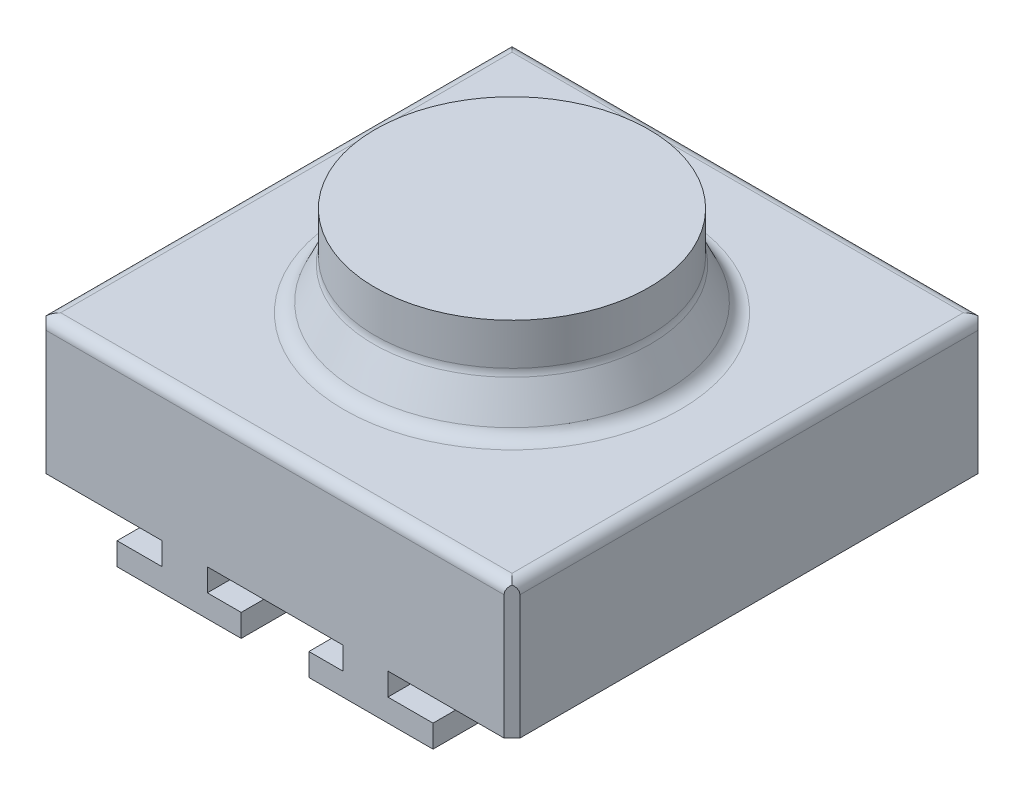
ISO-10303-21;
HEADER;
FILE_DESCRIPTION(('STEP AP214'),'2;1');
FILE_NAME('part.step','',(''),(''),'','','');
FILE_SCHEMA(('AUTOMOTIVE_DESIGN { 1 0 10303 214 1 1 1 1 }'));
ENDSEC;
DATA;
#1=APPLICATION_CONTEXT('core data for automotive mechanical design processes');
#2=APPLICATION_PROTOCOL_DEFINITION('international standard','automotive_design',2000,#1);
#3=PRODUCT_CONTEXT('',#1,'mechanical');
#4=PRODUCT('Part','Part','',(#3));
#5=PRODUCT_RELATED_PRODUCT_CATEGORY('part','',(#4));
#6=PRODUCT_DEFINITION_FORMATION('','',#4);
#7=PRODUCT_DEFINITION_CONTEXT('part definition',#1,'design');
#8=PRODUCT_DEFINITION('design','',#6,#7);
#9=PRODUCT_DEFINITION_SHAPE('','',#8);
#10=(LENGTH_UNIT() NAMED_UNIT(*) SI_UNIT(.MILLI.,.METRE.));
#11=(NAMED_UNIT(*) PLANE_ANGLE_UNIT() SI_UNIT($,.RADIAN.));
#12=(NAMED_UNIT(*) SI_UNIT($,.STERADIAN.) SOLID_ANGLE_UNIT());
#13=UNCERTAINTY_MEASURE_WITH_UNIT(LENGTH_MEASURE(1.E-05),#10,'distance_accuracy_value','');
#14=(GEOMETRIC_REPRESENTATION_CONTEXT(3) GLOBAL_UNCERTAINTY_ASSIGNED_CONTEXT((#13)) GLOBAL_UNIT_ASSIGNED_CONTEXT((#10,
#11,#12)) REPRESENTATION_CONTEXT('',''));
#15=CARTESIAN_POINT('',(0.,0.,0.));
#16=DIRECTION('',(0.,0.,1.));
#17=DIRECTION('',(1.,0.,0.));
#18=AXIS2_PLACEMENT_3D('',#15,#16,#17);
#19=CARTESIAN_POINT('',(0.,10.,210.));
#20=DIRECTION('',(1.,0.,0.));
#21=DIRECTION('',(0.,1.,0.));
#22=AXIS2_PLACEMENT_3D('',#19,#20,#21);
#23=PLANE('',#22);
#24=DIRECTION('',(0.,-1.,0.));
#25=VECTOR('',#24,1.);
#26=CARTESIAN_POINT('',(0.,10.,0.));
#27=LINE('',#26,#25);
#28=CARTESIAN_POINT('',(0.,10.,0.));
#29=VERTEX_POINT('',#28);
#30=CARTESIAN_POINT('',(0.,0.,0.));
#31=VERTEX_POINT('',#30);
#32=EDGE_CURVE('E256',#29,#31,#27,.T.);
#33=ORIENTED_EDGE('',*,*,#32,.T.);
#34=DIRECTION('',(0.,0.,-1.));
#35=VECTOR('',#34,1.);
#36=CARTESIAN_POINT('',(0.,0.,210.));
#37=LINE('',#36,#35);
#38=CARTESIAN_POINT('',(0.,0.,210.));
#39=VERTEX_POINT('',#38);
#40=EDGE_CURVE('E235',#39,#31,#37,.T.);
#41=ORIENTED_EDGE('',*,*,#40,.F.);
#42=DIRECTION('',(0.,-1.,0.));
#43=VECTOR('',#42,1.);
#44=CARTESIAN_POINT('',(0.,10.,210.));
#45=LINE('',#44,#43);
#46=CARTESIAN_POINT('',(0.,10.,210.));
#47=VERTEX_POINT('',#46);
#48=EDGE_CURVE('E243',#47,#39,#45,.T.);
#49=ORIENTED_EDGE('',*,*,#48,.F.);
#50=DIRECTION('',(0.,0.,-1.));
#51=VECTOR('',#50,1.);
#52=CARTESIAN_POINT('',(0.,10.,210.));
#53=LINE('',#52,#51);
#54=EDGE_CURVE('E402',#47,#29,#53,.T.);
#55=ORIENTED_EDGE('',*,*,#54,.T.);
#56=EDGE_LOOP('',(#33,#41,#49,#55));
#57=FACE_BOUND('',#56,.T.);
#58=ADVANCED_FACE('F45',(#57),#23,.F.);
#59=CARTESIAN_POINT('',(0.,0.,210.));
#60=DIRECTION('',(0.,1.,0.));
#61=DIRECTION('',(-1.,0.,0.));
#62=AXIS2_PLACEMENT_3D('',#59,#60,#61);
#63=PLANE('',#62);
#64=DIRECTION('',(1.,0.,0.));
#65=VECTOR('',#64,1.);
#66=CARTESIAN_POINT('',(0.,0.,0.));
#67=LINE('',#66,#65);
#68=CARTESIAN_POINT('',(55.,0.,0.));
#69=VERTEX_POINT('',#68);
#70=EDGE_CURVE('E356',#31,#69,#67,.T.);
#71=ORIENTED_EDGE('',*,*,#70,.T.);
#72=DIRECTION('',(0.,0.,-1.));
#73=VECTOR('',#72,1.);
#74=CARTESIAN_POINT('',(55.,0.,210.));
#75=LINE('',#74,#73);
#76=CARTESIAN_POINT('',(55.,0.,210.));
#77=VERTEX_POINT('',#76);
#78=EDGE_CURVE('E238',#77,#69,#75,.T.);
#79=ORIENTED_EDGE('',*,*,#78,.F.);
#80=DIRECTION('',(1.,0.,0.));
#81=VECTOR('',#80,1.);
#82=CARTESIAN_POINT('',(0.,0.,210.));
#83=LINE('',#82,#81);
#84=EDGE_CURVE('E231',#39,#77,#83,.T.);
#85=ORIENTED_EDGE('',*,*,#84,.F.);
#86=ORIENTED_EDGE('',*,*,#40,.T.);
#87=EDGE_LOOP('',(#71,#79,#85,#86));
#88=FACE_BOUND('',#87,.T.);
#89=ADVANCED_FACE('F233',(#88),#63,.F.);
#90=CARTESIAN_POINT('',(55.,0.,210.));
#91=DIRECTION('',(-1.,0.,0.));
#92=DIRECTION('',(0.,-1.,0.));
#93=AXIS2_PLACEMENT_3D('',#90,#91,#92);
#94=PLANE('',#93);
#95=DIRECTION('',(0.,1.,0.));
#96=VECTOR('',#95,1.);
#97=CARTESIAN_POINT('',(55.,0.,0.));
#98=LINE('',#97,#96);
#99=CARTESIAN_POINT('',(55.,9.99999999999997,0.));
#100=VERTEX_POINT('',#99);
#101=EDGE_CURVE('E406',#69,#100,#98,.T.);
#102=ORIENTED_EDGE('',*,*,#101,.T.);
#103=DIRECTION('',(0.,0.,-1.));
#104=VECTOR('',#103,1.);
#105=CARTESIAN_POINT('',(55.,9.99999999999997,210.));
#106=LINE('',#105,#104);
#107=CARTESIAN_POINT('',(55.,9.99999999999997,210.));
#108=VERTEX_POINT('',#107);
#109=EDGE_CURVE('E266',#108,#100,#106,.T.);
#110=ORIENTED_EDGE('',*,*,#109,.F.);
#111=DIRECTION('',(0.,1.,0.));
#112=VECTOR('',#111,1.);
#113=CARTESIAN_POINT('',(55.,0.,210.));
#114=LINE('',#113,#112);
#115=EDGE_CURVE('E242',#77,#108,#114,.T.);
#116=ORIENTED_EDGE('',*,*,#115,.F.);
#117=ORIENTED_EDGE('',*,*,#78,.T.);
#118=EDGE_LOOP('',(#102,#110,#116,#117));
#119=FACE_BOUND('',#118,.T.);
#120=ADVANCED_FACE('F530',(#119),#94,.F.);
#121=CARTESIAN_POINT('',(55.,9.99999999999997,210.));
#122=DIRECTION('',(0.,-1.,0.));
#123=DIRECTION('',(1.,0.,0.));
#124=AXIS2_PLACEMENT_3D('',#121,#122,#123);
#125=PLANE('',#124);
#126=DIRECTION('',(-1.,0.,0.));
#127=VECTOR('',#126,1.);
#128=CARTESIAN_POINT('',(55.,9.99999999999997,0.));
#129=LINE('',#128,#127);
#130=CARTESIAN_POINT('',(40.,10.,0.));
#131=VERTEX_POINT('',#130);
#132=EDGE_CURVE('E409',#100,#131,#129,.T.);
#133=ORIENTED_EDGE('',*,*,#132,.T.);
#134=DIRECTION('',(0.,0.,-1.));
#135=VECTOR('',#134,1.);
#136=CARTESIAN_POINT('',(40.,10.,210.));
#137=LINE('',#136,#135);
#138=CARTESIAN_POINT('',(40.,10.,210.));
#139=VERTEX_POINT('',#138);
#140=EDGE_CURVE('E502',#139,#131,#137,.T.);
#141=ORIENTED_EDGE('',*,*,#140,.F.);
#142=DIRECTION('',(-1.,0.,0.));
#143=VECTOR('',#142,1.);
#144=CARTESIAN_POINT('',(55.,9.99999999999997,210.));
#145=LINE('',#144,#143);
#146=EDGE_CURVE('E361',#108,#139,#145,.T.);
#147=ORIENTED_EDGE('',*,*,#146,.F.);
#148=ORIENTED_EDGE('',*,*,#109,.T.);
#149=EDGE_LOOP('',(#133,#141,#147,#148));
#150=FACE_BOUND('',#149,.T.);
#151=ADVANCED_FACE('F511',(#150),#125,.F.);
#152=CARTESIAN_POINT('',(40.,10.,210.));
#153=DIRECTION('',(-1.,0.,0.));
#154=DIRECTION('',(0.,0.,1.));
#155=AXIS2_PLACEMENT_3D('',#152,#153,#154);
#156=PLANE('',#155);
#157=DIRECTION('',(0.,1.,0.));
#158=VECTOR('',#157,1.);
#159=CARTESIAN_POINT('',(40.,10.,0.));
#160=LINE('',#159,#158);
#161=CARTESIAN_POINT('',(40.,20.,0.));
#162=VERTEX_POINT('',#161);
#163=EDGE_CURVE('E412',#131,#162,#160,.T.);
#164=ORIENTED_EDGE('',*,*,#163,.T.);
#165=DIRECTION('',(0.,0.,-1.));
#166=VECTOR('',#165,1.);
#167=CARTESIAN_POINT('',(40.,20.,210.));
#168=LINE('',#167,#166);
#169=CARTESIAN_POINT('',(40.,20.,210.));
#170=VERTEX_POINT('',#169);
#171=EDGE_CURVE('E498',#170,#162,#168,.T.);
#172=ORIENTED_EDGE('',*,*,#171,.F.);
#173=DIRECTION('',(0.,1.,0.));
#174=VECTOR('',#173,1.);
#175=CARTESIAN_POINT('',(40.,10.,210.));
#176=LINE('',#175,#174);
#177=EDGE_CURVE('E364',#139,#170,#176,.T.);
#178=ORIENTED_EDGE('',*,*,#177,.F.);
#179=ORIENTED_EDGE('',*,*,#140,.T.);
#180=EDGE_LOOP('',(#164,#172,#178,#179));
#181=FACE_BOUND('',#180,.T.);
#182=ADVANCED_FACE('F522',(#181),#156,.F.);
#183=CARTESIAN_POINT('',(100.,20.,210.));
#184=DIRECTION('',(0.,1.,0.));
#185=DIRECTION('',(-1.,0.,0.));
#186=AXIS2_PLACEMENT_3D('',#183,#184,#185);
#187=PLANE('',#186);
#188=DIRECTION('',(1.,0.,0.));
#189=VECTOR('',#188,1.);
#190=CARTESIAN_POINT('',(100.,20.,0.));
#191=LINE('',#190,#189);
#192=CARTESIAN_POINT('',(100.,20.,0.));
#193=VERTEX_POINT('',#192);
#194=EDGE_CURVE('E414',#162,#193,#191,.T.);
#195=ORIENTED_EDGE('',*,*,#194,.T.);
#196=DIRECTION('',(0.,0.,-1.));
#197=VECTOR('',#196,1.);
#198=CARTESIAN_POINT('',(100.,20.,210.));
#199=LINE('',#198,#197);
#200=CARTESIAN_POINT('',(100.,20.,210.));
#201=VERTEX_POINT('',#200);
#202=EDGE_CURVE('E494',#201,#193,#199,.T.);
#203=ORIENTED_EDGE('',*,*,#202,.F.);
#204=DIRECTION('',(1.,0.,0.));
#205=VECTOR('',#204,1.);
#206=CARTESIAN_POINT('',(100.,20.,210.));
#207=LINE('',#206,#205);
#208=EDGE_CURVE('E367',#170,#201,#207,.T.);
#209=ORIENTED_EDGE('',*,*,#208,.F.);
#210=ORIENTED_EDGE('',*,*,#171,.T.);
#211=EDGE_LOOP('',(#195,#203,#209,#210));
#212=FACE_BOUND('',#211,.T.);
#213=ADVANCED_FACE('F526',(#212),#187,.F.);
#214=CARTESIAN_POINT('',(100.,10.,210.));
#215=DIRECTION('',(1.,0.,0.));
#216=DIRECTION('',(0.,0.,-1.));
#217=AXIS2_PLACEMENT_3D('',#214,#215,#216);
#218=PLANE('',#217);
#219=DIRECTION('',(0.,-1.,0.));
#220=VECTOR('',#219,1.);
#221=CARTESIAN_POINT('',(100.,10.,0.));
#222=LINE('',#221,#220);
#223=CARTESIAN_POINT('',(100.,10.,0.));
#224=VERTEX_POINT('',#223);
#225=EDGE_CURVE('E417',#193,#224,#222,.T.);
#226=ORIENTED_EDGE('',*,*,#225,.T.);
#227=DIRECTION('',(0.,0.,-1.));
#228=VECTOR('',#227,1.);
#229=CARTESIAN_POINT('',(100.,10.,210.));
#230=LINE('',#229,#228);
#231=CARTESIAN_POINT('',(100.,10.,210.));
#232=VERTEX_POINT('',#231);
#233=EDGE_CURVE('E490',#232,#224,#230,.T.);
#234=ORIENTED_EDGE('',*,*,#233,.F.);
#235=DIRECTION('',(0.,-1.,0.));
#236=VECTOR('',#235,1.);
#237=CARTESIAN_POINT('',(100.,10.,210.));
#238=LINE('',#237,#236);
#239=EDGE_CURVE('E370',#201,#232,#238,.T.);
#240=ORIENTED_EDGE('',*,*,#239,.F.);
#241=ORIENTED_EDGE('',*,*,#202,.T.);
#242=EDGE_LOOP('',(#226,#234,#240,#241));
#243=FACE_BOUND('',#242,.T.);
#244=ADVANCED_FACE('F683',(#243),#218,.F.);
#245=CARTESIAN_POINT('',(85.,10.,210.));
#246=DIRECTION('',(0.,-1.,0.));
#247=DIRECTION('',(1.,0.,0.));
#248=AXIS2_PLACEMENT_3D('',#245,#246,#247);
#249=PLANE('',#248);
#250=DIRECTION('',(-1.,0.,0.));
#251=VECTOR('',#250,1.);
#252=CARTESIAN_POINT('',(85.,10.,0.));
#253=LINE('',#252,#251);
#254=CARTESIAN_POINT('',(85.,10.,0.));
#255=VERTEX_POINT('',#254);
#256=EDGE_CURVE('E420',#224,#255,#253,.T.);
#257=ORIENTED_EDGE('',*,*,#256,.T.);
#258=DIRECTION('',(0.,0.,-1.));
#259=VECTOR('',#258,1.);
#260=CARTESIAN_POINT('',(85.,10.,210.));
#261=LINE('',#260,#259);
#262=CARTESIAN_POINT('',(85.,10.,210.));
#263=VERTEX_POINT('',#262);
#264=EDGE_CURVE('E486',#263,#255,#261,.T.);
#265=ORIENTED_EDGE('',*,*,#264,.F.);
#266=DIRECTION('',(-1.,0.,0.));
#267=VECTOR('',#266,1.);
#268=CARTESIAN_POINT('',(85.,10.,210.));
#269=LINE('',#268,#267);
#270=EDGE_CURVE('E373',#232,#263,#269,.T.);
#271=ORIENTED_EDGE('',*,*,#270,.F.);
#272=ORIENTED_EDGE('',*,*,#233,.T.);
#273=EDGE_LOOP('',(#257,#265,#271,#272));
#274=FACE_BOUND('',#273,.T.);
#275=ADVANCED_FACE('F679',(#274),#249,.F.);
#276=CARTESIAN_POINT('',(85.,0.,210.));
#277=DIRECTION('',(1.,0.,0.));
#278=DIRECTION('',(0.,0.,-1.));
#279=AXIS2_PLACEMENT_3D('',#276,#277,#278);
#280=PLANE('',#279);
#281=DIRECTION('',(0.,-1.,0.));
#282=VECTOR('',#281,1.);
#283=CARTESIAN_POINT('',(85.,0.,0.));
#284=LINE('',#283,#282);
#285=CARTESIAN_POINT('',(85.,0.,0.));
#286=VERTEX_POINT('',#285);
#287=EDGE_CURVE('E423',#255,#286,#284,.T.);
#288=ORIENTED_EDGE('',*,*,#287,.T.);
#289=DIRECTION('',(0.,0.,-1.));
#290=VECTOR('',#289,1.);
#291=CARTESIAN_POINT('',(85.,0.,210.));
#292=LINE('',#291,#290);
#293=CARTESIAN_POINT('',(85.,0.,210.));
#294=VERTEX_POINT('',#293);
#295=EDGE_CURVE('E482',#294,#286,#292,.T.);
#296=ORIENTED_EDGE('',*,*,#295,.F.);
#297=DIRECTION('',(0.,-1.,0.));
#298=VECTOR('',#297,1.);
#299=CARTESIAN_POINT('',(85.,0.,210.));
#300=LINE('',#299,#298);
#301=EDGE_CURVE('E376',#263,#294,#300,.T.);
#302=ORIENTED_EDGE('',*,*,#301,.F.);
#303=ORIENTED_EDGE('',*,*,#264,.T.);
#304=EDGE_LOOP('',(#288,#296,#302,#303));
#305=FACE_BOUND('',#304,.T.);
#306=ADVANCED_FACE('F675',(#305),#280,.F.);
#307=CARTESIAN_POINT('',(140.,0.,210.));
#308=DIRECTION('',(0.,1.,0.));
#309=DIRECTION('',(0.,0.,1.));
#310=AXIS2_PLACEMENT_3D('',#307,#308,#309);
#311=PLANE('',#310);
#312=DIRECTION('',(1.,0.,0.));
#313=VECTOR('',#312,1.);
#314=CARTESIAN_POINT('',(140.,0.,0.));
#315=LINE('',#314,#313);
#316=CARTESIAN_POINT('',(140.,0.,0.));
#317=VERTEX_POINT('',#316);
#318=EDGE_CURVE('E426',#286,#317,#315,.T.);
#319=ORIENTED_EDGE('',*,*,#318,.T.);
#320=DIRECTION('',(0.,0.,-1.));
#321=VECTOR('',#320,1.);
#322=CARTESIAN_POINT('',(140.,0.,210.));
#323=LINE('',#322,#321);
#324=CARTESIAN_POINT('',(140.,0.,210.));
#325=VERTEX_POINT('',#324);
#326=EDGE_CURVE('E478',#325,#317,#323,.T.);
#327=ORIENTED_EDGE('',*,*,#326,.F.);
#328=DIRECTION('',(1.,0.,0.));
#329=VECTOR('',#328,1.);
#330=CARTESIAN_POINT('',(140.,0.,210.));
#331=LINE('',#330,#329);
#332=EDGE_CURVE('E379',#294,#325,#331,.T.);
#333=ORIENTED_EDGE('',*,*,#332,.F.);
#334=ORIENTED_EDGE('',*,*,#295,.T.);
#335=EDGE_LOOP('',(#319,#327,#333,#334));
#336=FACE_BOUND('',#335,.T.);
#337=ADVANCED_FACE('F671',(#336),#311,.F.);
#338=CARTESIAN_POINT('',(140.,9.99999999999999,210.));
#339=DIRECTION('',(-1.,0.,0.));
#340=DIRECTION('',(0.,0.,1.));
#341=AXIS2_PLACEMENT_3D('',#338,#339,#340);
#342=PLANE('',#341);
#343=DIRECTION('',(0.,1.,0.));
#344=VECTOR('',#343,1.);
#345=CARTESIAN_POINT('',(140.,9.99999999999999,0.));
#346=LINE('',#345,#344);
#347=CARTESIAN_POINT('',(140.,9.99999999999999,0.));
#348=VERTEX_POINT('',#347);
#349=EDGE_CURVE('E429',#317,#348,#346,.T.);
#350=ORIENTED_EDGE('',*,*,#349,.T.);
#351=DIRECTION('',(0.,0.,-1.));
#352=VECTOR('',#351,1.);
#353=CARTESIAN_POINT('',(140.,9.99999999999999,210.));
#354=LINE('',#353,#352);
#355=CARTESIAN_POINT('',(140.,9.99999999999999,210.));
#356=VERTEX_POINT('',#355);
#357=EDGE_CURVE('E474',#356,#348,#354,.T.);
#358=ORIENTED_EDGE('',*,*,#357,.F.);
#359=DIRECTION('',(0.,1.,0.));
#360=VECTOR('',#359,1.);
#361=CARTESIAN_POINT('',(140.,9.99999999999999,210.));
#362=LINE('',#361,#360);
#363=EDGE_CURVE('E382',#325,#356,#362,.T.);
#364=ORIENTED_EDGE('',*,*,#363,.F.);
#365=ORIENTED_EDGE('',*,*,#326,.T.);
#366=EDGE_LOOP('',(#350,#358,#364,#365));
#367=FACE_BOUND('',#366,.T.);
#368=ADVANCED_FACE('F667',(#367),#342,.F.);
#369=CARTESIAN_POINT('',(120.,10.,210.));
#370=DIRECTION('',(0.,-1.,0.));
#371=DIRECTION('',(1.,0.,0.));
#372=AXIS2_PLACEMENT_3D('',#369,#370,#371);
#373=PLANE('',#372);
#374=DIRECTION('',(-1.,0.,0.));
#375=VECTOR('',#374,1.);
#376=CARTESIAN_POINT('',(120.,10.,0.));
#377=LINE('',#376,#375);
#378=CARTESIAN_POINT('',(120.,10.,0.));
#379=VERTEX_POINT('',#378);
#380=EDGE_CURVE('E431',#348,#379,#377,.T.);
#381=ORIENTED_EDGE('',*,*,#380,.T.);
#382=DIRECTION('',(0.,0.,-1.));
#383=VECTOR('',#382,1.);
#384=CARTESIAN_POINT('',(120.,10.,210.));
#385=LINE('',#384,#383);
#386=CARTESIAN_POINT('',(120.,10.,210.));
#387=VERTEX_POINT('',#386);
#388=EDGE_CURVE('E470',#387,#379,#385,.T.);
#389=ORIENTED_EDGE('',*,*,#388,.F.);
#390=DIRECTION('',(-1.,0.,0.));
#391=VECTOR('',#390,1.);
#392=CARTESIAN_POINT('',(120.,10.,210.));
#393=LINE('',#392,#391);
#394=EDGE_CURVE('E385',#356,#387,#393,.T.);
#395=ORIENTED_EDGE('',*,*,#394,.F.);
#396=ORIENTED_EDGE('',*,*,#357,.T.);
#397=EDGE_LOOP('',(#381,#389,#395,#396));
#398=FACE_BOUND('',#397,.T.);
#399=ADVANCED_FACE('F663',(#398),#373,.F.);
#400=CARTESIAN_POINT('',(120.,20.,210.));
#401=DIRECTION('',(-1.,0.,0.));
#402=DIRECTION('',(0.,0.,1.));
#403=AXIS2_PLACEMENT_3D('',#400,#401,#402);
#404=PLANE('',#403);
#405=DIRECTION('',(0.,1.,0.));
#406=VECTOR('',#405,1.);
#407=CARTESIAN_POINT('',(120.,20.,0.));
#408=LINE('',#407,#406);
#409=CARTESIAN_POINT('',(120.,20.,0.));
#410=VERTEX_POINT('',#409);
#411=EDGE_CURVE('E434',#379,#410,#408,.T.);
#412=ORIENTED_EDGE('',*,*,#411,.T.);
#413=DIRECTION('',(0.,0.,-1.));
#414=VECTOR('',#413,1.);
#415=CARTESIAN_POINT('',(120.,20.,210.));
#416=LINE('',#415,#414);
#417=CARTESIAN_POINT('',(120.,20.,210.));
#418=VERTEX_POINT('',#417);
#419=EDGE_CURVE('E466',#418,#410,#416,.T.);
#420=ORIENTED_EDGE('',*,*,#419,.F.);
#421=DIRECTION('',(0.,1.,0.));
#422=VECTOR('',#421,1.);
#423=CARTESIAN_POINT('',(120.,20.,210.));
#424=LINE('',#423,#422);
#425=EDGE_CURVE('E388',#387,#418,#424,.T.);
#426=ORIENTED_EDGE('',*,*,#425,.F.);
#427=ORIENTED_EDGE('',*,*,#388,.T.);
#428=EDGE_LOOP('',(#412,#420,#426,#427));
#429=FACE_BOUND('',#428,.T.);
#430=ADVANCED_FACE('F660',(#429),#404,.F.);
#431=CARTESIAN_POINT('',(175.,20.,210.));
#432=DIRECTION('',(0.,1.,0.));
#433=DIRECTION('',(-1.,0.,0.));
#434=AXIS2_PLACEMENT_3D('',#431,#432,#433);
#435=PLANE('',#434);
#436=DIRECTION('',(1.,0.,0.));
#437=VECTOR('',#436,1.);
#438=CARTESIAN_POINT('',(175.,20.,0.));
#439=LINE('',#438,#437);
#440=CARTESIAN_POINT('',(171.5,20.,0.));
#441=VERTEX_POINT('',#440);
#442=EDGE_CURVE('E437',#410,#441,#439,.T.);
#443=ORIENTED_EDGE('',*,*,#442,.T.);
#444=DIRECTION('',(-0.707106781186548,0.,-0.707106781186547));
#445=VECTOR('',#444,1.);
#446=CARTESIAN_POINT('',(175.,20.,3.49999999999999));
#447=LINE('',#446,#445);
#448=CARTESIAN_POINT('',(175.,20.,3.5));
#449=VERTEX_POINT('',#448);
#450=EDGE_CURVE('E287',#441,#449,#447,.F.);
#451=ORIENTED_EDGE('',*,*,#450,.T.);
#452=DIRECTION('',(0.,0.,-1.));
#453=VECTOR('',#452,1.);
#454=CARTESIAN_POINT('',(175.,20.,210.));
#455=LINE('',#454,#453);
#456=CARTESIAN_POINT('',(175.,20.,206.5));
#457=VERTEX_POINT('',#456);
#458=EDGE_CURVE('E462',#457,#449,#455,.T.);
#459=ORIENTED_EDGE('',*,*,#458,.F.);
#460=DIRECTION('',(-0.707106781186548,0.,0.707106781186547));
#461=VECTOR('',#460,1.);
#462=CARTESIAN_POINT('',(171.5,20.,210.));
#463=LINE('',#462,#461);
#464=CARTESIAN_POINT('',(171.5,20.,210.));
#465=VERTEX_POINT('',#464);
#466=EDGE_CURVE('E285',#457,#465,#463,.T.);
#467=ORIENTED_EDGE('',*,*,#466,.T.);
#468=DIRECTION('',(1.,0.,0.));
#469=VECTOR('',#468,1.);
#470=CARTESIAN_POINT('',(175.,20.,210.));
#471=LINE('',#470,#469);
#472=EDGE_CURVE('E391',#418,#465,#471,.T.);
#473=ORIENTED_EDGE('',*,*,#472,.F.);
#474=ORIENTED_EDGE('',*,*,#419,.T.);
#475=EDGE_LOOP('',(#443,#451,#459,#467,#473,#474));
#476=FACE_BOUND('',#475,.T.);
#477=ADVANCED_FACE('F616',(#476),#435,.F.);
#478=CARTESIAN_POINT('',(175.,80.,210.));
#479=DIRECTION('',(-1.,0.,0.));
#480=DIRECTION('',(0.,-1.,0.));
#481=AXIS2_PLACEMENT_3D('',#478,#479,#480);
#482=PLANE('',#481);
#483=DIRECTION('',(0.,1.,0.));
#484=VECTOR('',#483,1.);
#485=CARTESIAN_POINT('',(175.,80.,3.5));
#486=LINE('',#485,#484);
#487=CARTESIAN_POINT('',(175.,75.,3.5));
#488=VERTEX_POINT('',#487);
#489=EDGE_CURVE('E282',#449,#488,#486,.T.);
#490=ORIENTED_EDGE('',*,*,#489,.T.);
#491=DIRECTION('',(0.,0.,-1.));
#492=VECTOR('',#491,1.);
#493=CARTESIAN_POINT('',(175.,75.,210.));
#494=LINE('',#493,#492);
#495=CARTESIAN_POINT('',(175.,75.,206.5));
#496=VERTEX_POINT('',#495);
#497=EDGE_CURVE('E331',#488,#496,#494,.F.);
#498=ORIENTED_EDGE('',*,*,#497,.T.);
#499=DIRECTION('',(0.,-1.,0.));
#500=VECTOR('',#499,1.);
#501=CARTESIAN_POINT('',(175.,20.,206.5));
#502=LINE('',#501,#500);
#503=EDGE_CURVE('E280',#496,#457,#502,.T.);
#504=ORIENTED_EDGE('',*,*,#503,.T.);
#505=ORIENTED_EDGE('',*,*,#458,.T.);
#506=EDGE_LOOP('',(#490,#498,#504,#505));
#507=FACE_BOUND('',#506,.T.);
#508=ADVANCED_FACE('F620',(#507),#482,.F.);
#509=CARTESIAN_POINT('',(-35.,80.,210.));
#510=DIRECTION('',(0.,-1.,0.));
#511=DIRECTION('',(1.,0.,0.));
#512=AXIS2_PLACEMENT_3D('',#509,#510,#511);
#513=PLANE('',#512);
#514=DIRECTION('',(-1.,0.,0.));
#515=VECTOR('',#514,1.);
#516=CARTESIAN_POINT('',(-35.,80.,5.));
#517=LINE('',#516,#515);
#518=CARTESIAN_POINT('',(170.,80.,5.));
#519=VERTEX_POINT('',#518);
#520=CARTESIAN_POINT('',(-30.,80.,5.));
#521=VERTEX_POINT('',#520);
#522=EDGE_CURVE('E316',#519,#521,#517,.T.);
#523=ORIENTED_EDGE('',*,*,#522,.T.);
#524=DIRECTION('',(0.,0.,-1.));
#525=VECTOR('',#524,1.);
#526=CARTESIAN_POINT('',(-30.,80.,210.));
#527=LINE('',#526,#525);
#528=CARTESIAN_POINT('',(-30.,80.,205.));
#529=VERTEX_POINT('',#528);
#530=EDGE_CURVE('E318',#521,#529,#527,.F.);
#531=ORIENTED_EDGE('',*,*,#530,.T.);
#532=DIRECTION('',(-1.,0.,0.));
#533=VECTOR('',#532,1.);
#534=CARTESIAN_POINT('',(171.5,80.,205.));
#535=LINE('',#534,#533);
#536=CARTESIAN_POINT('',(170.,80.,205.));
#537=VERTEX_POINT('',#536);
#538=EDGE_CURVE('E312',#529,#537,#535,.F.);
#539=ORIENTED_EDGE('',*,*,#538,.T.);
#540=DIRECTION('',(0.,0.,-1.));
#541=VECTOR('',#540,1.);
#542=CARTESIAN_POINT('',(170.,80.,210.));
#543=LINE('',#542,#541);
#544=EDGE_CURVE('E314',#537,#519,#543,.T.);
#545=ORIENTED_EDGE('',*,*,#544,.T.);
#546=EDGE_LOOP('',(#523,#531,#539,#545));
#547=FACE_BOUND('',#546,.T.);
#548=CARTESIAN_POINT('',(70.,80.,105.));
#549=DIRECTION('',(0.,-1.,0.));
#550=DIRECTION('',(1.,0.,0.));
#551=AXIS2_PLACEMENT_3D('',#548,#549,#550);
#552=CIRCLE('',#551,74.4594918256525);
#553=CARTESIAN_POINT('',(144.459491825652,80.,105.));
#554=VERTEX_POINT('',#553);
#555=EDGE_CURVE('E302',#554,#554,#552,.T.);
#556=ORIENTED_EDGE('',*,*,#555,.T.);
#557=EDGE_LOOP('',(#556));
#558=FACE_BOUND('',#557,.T.);
#559=ADVANCED_FACE('F600',(#547,#558),#513,.F.);
#560=CARTESIAN_POINT('',(-35.,20.,210.));
#561=DIRECTION('',(1.,0.,0.));
#562=DIRECTION('',(0.,0.,-1.));
#563=AXIS2_PLACEMENT_3D('',#560,#561,#562);
#564=PLANE('',#563);
#565=DIRECTION('',(0.,1.,0.));
#566=VECTOR('',#565,1.);
#567=CARTESIAN_POINT('',(-35.,80.,206.5));
#568=LINE('',#567,#566);
#569=CARTESIAN_POINT('',(-35.,20.,206.5));
#570=VERTEX_POINT('',#569);
#571=CARTESIAN_POINT('',(-35.,75.,206.5));
#572=VERTEX_POINT('',#571);
#573=EDGE_CURVE('E258',#570,#572,#568,.T.);
#574=ORIENTED_EDGE('',*,*,#573,.T.);
#575=DIRECTION('',(0.,0.,-1.));
#576=VECTOR('',#575,1.);
#577=CARTESIAN_POINT('',(-35.,75.,210.));
#578=LINE('',#577,#576);
#579=CARTESIAN_POINT('',(-35.,75.,3.5));
#580=VERTEX_POINT('',#579);
#581=EDGE_CURVE('E305',#572,#580,#578,.T.);
#582=ORIENTED_EDGE('',*,*,#581,.T.);
#583=DIRECTION('',(0.,-1.,0.));
#584=VECTOR('',#583,1.);
#585=CARTESIAN_POINT('',(-35.,20.,3.5));
#586=LINE('',#585,#584);
#587=CARTESIAN_POINT('',(-35.,20.,3.5));
#588=VERTEX_POINT('',#587);
#589=EDGE_CURVE('E263',#580,#588,#586,.T.);
#590=ORIENTED_EDGE('',*,*,#589,.T.);
#591=DIRECTION('',(0.,0.,-1.));
#592=VECTOR('',#591,1.);
#593=CARTESIAN_POINT('',(-35.,20.,210.));
#594=LINE('',#593,#592);
#595=EDGE_CURVE('E458',#570,#588,#594,.T.);
#596=ORIENTED_EDGE('',*,*,#595,.F.);
#597=EDGE_LOOP('',(#574,#582,#590,#596));
#598=FACE_BOUND('',#597,.T.);
#599=ADVANCED_FACE('F629',(#598),#564,.F.);
#600=CARTESIAN_POINT('',(20.,20.,210.));
#601=DIRECTION('',(0.,1.,0.));
#602=DIRECTION('',(-1.,0.,0.));
#603=AXIS2_PLACEMENT_3D('',#600,#601,#602);
#604=PLANE('',#603);
#605=ORIENTED_EDGE('',*,*,#595,.T.);
#606=DIRECTION('',(-0.707106781186548,0.,0.707106781186548));
#607=VECTOR('',#606,1.);
#608=CARTESIAN_POINT('',(-35.,20.,3.5));
#609=LINE('',#608,#607);
#610=CARTESIAN_POINT('',(-31.5,20.,0.));
#611=VERTEX_POINT('',#610);
#612=EDGE_CURVE('E273',#588,#611,#609,.F.);
#613=ORIENTED_EDGE('',*,*,#612,.T.);
#614=DIRECTION('',(1.,0.,0.));
#615=VECTOR('',#614,1.);
#616=CARTESIAN_POINT('',(20.,20.,0.));
#617=LINE('',#616,#615);
#618=CARTESIAN_POINT('',(20.,20.,0.));
#619=VERTEX_POINT('',#618);
#620=EDGE_CURVE('E441',#611,#619,#617,.T.);
#621=ORIENTED_EDGE('',*,*,#620,.T.);
#622=DIRECTION('',(0.,0.,-1.));
#623=VECTOR('',#622,1.);
#624=CARTESIAN_POINT('',(20.,20.,210.));
#625=LINE('',#624,#623);
#626=CARTESIAN_POINT('',(20.,20.,210.));
#627=VERTEX_POINT('',#626);
#628=EDGE_CURVE('E454',#627,#619,#625,.T.);
#629=ORIENTED_EDGE('',*,*,#628,.F.);
#630=DIRECTION('',(1.,0.,0.));
#631=VECTOR('',#630,1.);
#632=CARTESIAN_POINT('',(20.,20.,210.));
#633=LINE('',#632,#631);
#634=CARTESIAN_POINT('',(-31.4999999999999,20.,210.));
#635=VERTEX_POINT('',#634);
#636=EDGE_CURVE('E395',#635,#627,#633,.T.);
#637=ORIENTED_EDGE('',*,*,#636,.F.);
#638=DIRECTION('',(-0.707106781186548,0.,-0.707106781186548));
#639=VECTOR('',#638,1.);
#640=CARTESIAN_POINT('',(-31.4999999999999,20.,210.));
#641=LINE('',#640,#639);
#642=EDGE_CURVE('E271',#635,#570,#641,.T.);
#643=ORIENTED_EDGE('',*,*,#642,.T.);
#644=EDGE_LOOP('',(#605,#613,#621,#629,#637,#643));
#645=FACE_BOUND('',#644,.T.);
#646=ADVANCED_FACE('F632',(#645),#604,.F.);
#647=CARTESIAN_POINT('',(20.,20.,210.));
#648=DIRECTION('',(1.,0.,0.));
#649=DIRECTION('',(0.,1.,0.));
#650=AXIS2_PLACEMENT_3D('',#647,#648,#649);
#651=PLANE('',#650);
#652=DIRECTION('',(0.,-1.,0.));
#653=VECTOR('',#652,1.);
#654=CARTESIAN_POINT('',(20.,20.,0.));
#655=LINE('',#654,#653);
#656=CARTESIAN_POINT('',(20.,10.,0.));
#657=VERTEX_POINT('',#656);
#658=EDGE_CURVE('E444',#619,#657,#655,.T.);
#659=ORIENTED_EDGE('',*,*,#658,.T.);
#660=DIRECTION('',(0.,0.,-1.));
#661=VECTOR('',#660,1.);
#662=CARTESIAN_POINT('',(20.,10.,210.));
#663=LINE('',#662,#661);
#664=CARTESIAN_POINT('',(20.,10.,210.));
#665=VERTEX_POINT('',#664);
#666=EDGE_CURVE('E450',#665,#657,#663,.T.);
#667=ORIENTED_EDGE('',*,*,#666,.F.);
#668=DIRECTION('',(0.,-1.,0.));
#669=VECTOR('',#668,1.);
#670=CARTESIAN_POINT('',(20.,20.,210.));
#671=LINE('',#670,#669);
#672=EDGE_CURVE('E398',#627,#665,#671,.T.);
#673=ORIENTED_EDGE('',*,*,#672,.F.);
#674=ORIENTED_EDGE('',*,*,#628,.T.);
#675=EDGE_LOOP('',(#659,#667,#673,#674));
#676=FACE_BOUND('',#675,.T.);
#677=ADVANCED_FACE('F636',(#676),#651,.F.);
#678=CARTESIAN_POINT('',(20.,10.,210.));
#679=DIRECTION('',(0.,-1.,0.));
#680=DIRECTION('',(1.,0.,0.));
#681=AXIS2_PLACEMENT_3D('',#678,#679,#680);
#682=PLANE('',#681);
#683=DIRECTION('',(-1.,0.,0.));
#684=VECTOR('',#683,1.);
#685=CARTESIAN_POINT('',(20.,10.,0.));
#686=LINE('',#685,#684);
#687=EDGE_CURVE('E253',#657,#29,#686,.T.);
#688=ORIENTED_EDGE('',*,*,#687,.T.);
#689=ORIENTED_EDGE('',*,*,#54,.F.);
#690=DIRECTION('',(-1.,0.,0.));
#691=VECTOR('',#690,1.);
#692=CARTESIAN_POINT('',(20.,10.,210.));
#693=LINE('',#692,#691);
#694=EDGE_CURVE('E248',#665,#47,#693,.T.);
#695=ORIENTED_EDGE('',*,*,#694,.F.);
#696=ORIENTED_EDGE('',*,*,#666,.T.);
#697=EDGE_LOOP('',(#688,#689,#695,#696));
#698=FACE_BOUND('',#697,.T.);
#699=ADVANCED_FACE('F639',(#698),#682,.F.);
#700=CARTESIAN_POINT('',(0.,0.,210.));
#701=DIRECTION('',(0.,0.,1.));
#702=DIRECTION('',(1.,0.,0.));
#703=AXIS2_PLACEMENT_3D('',#700,#701,#702);
#704=PLANE('',#703);
#705=DIRECTION('',(0.,1.,0.));
#706=VECTOR('',#705,1.);
#707=CARTESIAN_POINT('',(171.5,80.,210.));
#708=LINE('',#707,#706);
#709=CARTESIAN_POINT('',(171.5,75.,210.));
#710=VERTEX_POINT('',#709);
#711=EDGE_CURVE('E289',#465,#710,#708,.T.);
#712=ORIENTED_EDGE('',*,*,#711,.T.);
#713=DIRECTION('',(-1.,0.,0.));
#714=VECTOR('',#713,1.);
#715=CARTESIAN_POINT('',(-31.4999999999999,75.,210.));
#716=LINE('',#715,#714);
#717=CARTESIAN_POINT('',(-31.4999999999999,75.,210.));
#718=VERTEX_POINT('',#717);
#719=EDGE_CURVE('E11',#710,#718,#716,.T.);
#720=ORIENTED_EDGE('',*,*,#719,.T.);
#721=DIRECTION('',(0.,-1.,0.));
#722=VECTOR('',#721,1.);
#723=CARTESIAN_POINT('',(-31.4999999999999,20.,210.));
#724=LINE('',#723,#722);
#725=EDGE_CURVE('E291',#718,#635,#724,.T.);
#726=ORIENTED_EDGE('',*,*,#725,.T.);
#727=ORIENTED_EDGE('',*,*,#636,.T.);
#728=ORIENTED_EDGE('',*,*,#672,.T.);
#729=ORIENTED_EDGE('',*,*,#694,.T.);
#730=ORIENTED_EDGE('',*,*,#48,.T.);
#731=ORIENTED_EDGE('',*,*,#84,.T.);
#732=ORIENTED_EDGE('',*,*,#115,.T.);
#733=ORIENTED_EDGE('',*,*,#146,.T.);
#734=ORIENTED_EDGE('',*,*,#177,.T.);
#735=ORIENTED_EDGE('',*,*,#208,.T.);
#736=ORIENTED_EDGE('',*,*,#239,.T.);
#737=ORIENTED_EDGE('',*,*,#270,.T.);
#738=ORIENTED_EDGE('',*,*,#301,.T.);
#739=ORIENTED_EDGE('',*,*,#332,.T.);
#740=ORIENTED_EDGE('',*,*,#363,.T.);
#741=ORIENTED_EDGE('',*,*,#394,.T.);
#742=ORIENTED_EDGE('',*,*,#425,.T.);
#743=ORIENTED_EDGE('',*,*,#472,.T.);
#744=EDGE_LOOP('',(#712,#720,#726,#727,#728,#729,#730,#731,#732,#733,#734,#735,#736,#737,#738,
#739,#740,#741,#742,#743));
#745=FACE_BOUND('',#744,.T.);
#746=ADVANCED_FACE('F246',(#745),#704,.T.);
#747=CARTESIAN_POINT('',(0.,0.,0.));
#748=DIRECTION('',(0.,0.,1.));
#749=DIRECTION('',(1.,0.,0.));
#750=AXIS2_PLACEMENT_3D('',#747,#748,#749);
#751=PLANE('',#750);
#752=DIRECTION('',(0.,1.,0.));
#753=VECTOR('',#752,1.);
#754=CARTESIAN_POINT('',(-31.5,0.,0.));
#755=LINE('',#754,#753);
#756=CARTESIAN_POINT('',(-31.5,75.,0.));
#757=VERTEX_POINT('',#756);
#758=EDGE_CURVE('E277',#611,#757,#755,.T.);
#759=ORIENTED_EDGE('',*,*,#758,.T.);
#760=DIRECTION('',(-1.,0.,0.));
#761=VECTOR('',#760,1.);
#762=CARTESIAN_POINT('',(0.,75.,0.));
#763=LINE('',#762,#761);
#764=CARTESIAN_POINT('',(171.5,75.,0.));
#765=VERTEX_POINT('',#764);
#766=EDGE_CURVE('E325',#757,#765,#763,.F.);
#767=ORIENTED_EDGE('',*,*,#766,.T.);
#768=DIRECTION('',(0.,-1.,0.));
#769=VECTOR('',#768,1.);
#770=CARTESIAN_POINT('',(171.5,0.,0.));
#771=LINE('',#770,#769);
#772=EDGE_CURVE('E275',#765,#441,#771,.T.);
#773=ORIENTED_EDGE('',*,*,#772,.T.);
#774=ORIENTED_EDGE('',*,*,#442,.F.);
#775=ORIENTED_EDGE('',*,*,#411,.F.);
#776=ORIENTED_EDGE('',*,*,#380,.F.);
#777=ORIENTED_EDGE('',*,*,#349,.F.);
#778=ORIENTED_EDGE('',*,*,#318,.F.);
#779=ORIENTED_EDGE('',*,*,#287,.F.);
#780=ORIENTED_EDGE('',*,*,#256,.F.);
#781=ORIENTED_EDGE('',*,*,#225,.F.);
#782=ORIENTED_EDGE('',*,*,#194,.F.);
#783=ORIENTED_EDGE('',*,*,#163,.F.);
#784=ORIENTED_EDGE('',*,*,#132,.F.);
#785=ORIENTED_EDGE('',*,*,#101,.F.);
#786=ORIENTED_EDGE('',*,*,#70,.F.);
#787=ORIENTED_EDGE('',*,*,#32,.F.);
#788=ORIENTED_EDGE('',*,*,#687,.F.);
#789=ORIENTED_EDGE('',*,*,#658,.F.);
#790=ORIENTED_EDGE('',*,*,#620,.F.);
#791=EDGE_LOOP('',(#759,#767,#773,#774,#775,#776,#777,#778,#779,#780,#781,#782,#783,#784,#785,
#786,#787,#788,#789,#790));
#792=FACE_BOUND('',#791,.T.);
#793=ADVANCED_FACE('F517',(#792),#751,.F.);
#794=CARTESIAN_POINT('',(70.,80.,105.));
#795=DIRECTION('',(0.,-1.,0.));
#796=DIRECTION('',(-1.,0.,0.));
#797=AXIS2_PLACEMENT_3D('',#794,#795,#796);
#798=CONICAL_SURFACE('',#797,70.,0.436332312998583);
#799=CARTESIAN_POINT('',(70.,98.5935348063157,105.));
#800=DIRECTION('',(0.,-1.,0.));
#801=DIRECTION('',(1.,0.,0.));
#802=AXIS2_PLACEMENT_3D('',#799,#800,#801);
#803=CIRCLE('',#802,61.3296923276435);
#804=CARTESIAN_POINT('',(131.329692327643,98.5935348063157,105.));
#805=VERTEX_POINT('',#804);
#806=EDGE_CURVE('E299',#805,#805,#803,.T.);
#807=ORIENTED_EDGE('',*,*,#806,.T.);
#808=EDGE_LOOP('',(#807));
#809=FACE_BOUND('',#808,.T.);
#810=CARTESIAN_POINT('',(70.,84.0416721678151,105.));
#811=DIRECTION('',(0.,-1.,0.));
#812=DIRECTION('',(1.,0.,0.));
#813=AXIS2_PLACEMENT_3D('',#810,#811,#812);
#814=CIRCLE('',#813,68.1153373163959);
#815=CARTESIAN_POINT('',(138.115337316396,84.0416721678151,105.));
#816=VERTEX_POINT('',#815);
#817=EDGE_CURVE('E296',#816,#816,#814,.F.);
#818=ORIENTED_EDGE('',*,*,#817,.T.);
#819=EDGE_LOOP('',(#818));
#820=FACE_BOUND('',#819,.T.);
#821=ADVANCED_FACE('F776',(#809,#820),#798,.T.);
#822=CARTESIAN_POINT('',(70.,120.,105.));
#823=DIRECTION('',(0.,-1.,0.));
#824=DIRECTION('',(1.,0.,0.));
#825=AXIS2_PLACEMENT_3D('',#822,#823,#824);
#826=CYLINDRICAL_SURFACE('',#825,60.6738468369001);
#827=CARTESIAN_POINT('',(70.,101.551862638501,105.));
#828=DIRECTION('',(0.,1.,0.));
#829=DIRECTION('',(-1.,0.,0.));
#830=AXIS2_PLACEMENT_3D('',#827,#828,#829);
#831=CIRCLE('',#830,60.6738468369001);
#832=CARTESIAN_POINT('',(9.32615316309994,101.551862638501,105.));
#833=VERTEX_POINT('',#832);
#834=EDGE_CURVE('E293',#833,#833,#831,.T.);
#835=ORIENTED_EDGE('',*,*,#834,.T.);
#836=EDGE_LOOP('',(#835));
#837=FACE_BOUND('',#836,.T.);
#838=CARTESIAN_POINT('',(70.,120.,105.));
#839=DIRECTION('',(0.,1.,0.));
#840=DIRECTION('',(-1.,0.,0.));
#841=AXIS2_PLACEMENT_3D('',#838,#839,#840);
#842=CIRCLE('',#841,60.6738468369001);
#843=CARTESIAN_POINT('',(9.32615316309994,120.,105.));
#844=VERTEX_POINT('',#843);
#845=EDGE_CURVE('E346',#844,#844,#842,.T.);
#846=ORIENTED_EDGE('',*,*,#845,.F.);
#847=EDGE_LOOP('',(#846));
#848=FACE_BOUND('',#847,.T.);
#849=ADVANCED_FACE('F766',(#837,#848),#826,.T.);
#850=CARTESIAN_POINT('',(70.,120.,105.));
#851=DIRECTION('',(0.,1.,0.));
#852=DIRECTION('',(-1.,0.,0.));
#853=AXIS2_PLACEMENT_3D('',#850,#851,#852);
#854=PLANE('',#853);
#855=ORIENTED_EDGE('',*,*,#845,.T.);
#856=EDGE_LOOP('',(#855));
#857=FACE_BOUND('',#856,.T.);
#858=ADVANCED_FACE('F550',(#857),#854,.T.);
#859=CARTESIAN_POINT('',(-35.,20.,3.5));
#860=DIRECTION('',(0.707106781186547,0.,0.707106781186547));
#861=DIRECTION('',(0.,-1.,0.));
#862=AXIS2_PLACEMENT_3D('',#859,#860,#861);
#863=PLANE('',#862);
#864=ORIENTED_EDGE('',*,*,#589,.F.);
#865=CARTESIAN_POINT('',(-30.,75.,-1.49999999999997));
#866=DIRECTION('',(0.707106781186547,0.,0.707106781186547));
#867=DIRECTION('',(0.707106781186548,0.,-0.707106781186548));
#868=AXIS2_PLACEMENT_3D('',#865,#866,#867);
#869=ELLIPSE('',#868,7.07106781186548,5.);
#870=CARTESIAN_POINT('',(-33.25,78.7996710383927,1.75000000000001));
#871=VERTEX_POINT('',#870);
#872=EDGE_CURVE('E310',#580,#871,#869,.F.);
#873=ORIENTED_EDGE('',*,*,#872,.T.);
#874=CARTESIAN_POINT('',(-36.5,75.,5.));
#875=DIRECTION('',(0.707106781186547,0.,0.707106781186547));
#876=DIRECTION('',(-0.707106781186548,0.,0.707106781186548));
#877=AXIS2_PLACEMENT_3D('',#874,#875,#876);
#878=ELLIPSE('',#877,7.07106781186548,5.);
#879=EDGE_CURVE('E308',#871,#757,#878,.F.);
#880=ORIENTED_EDGE('',*,*,#879,.T.);
#881=ORIENTED_EDGE('',*,*,#758,.F.);
#882=ORIENTED_EDGE('',*,*,#612,.F.);
#883=EDGE_LOOP('',(#864,#873,#880,#881,#882));
#884=FACE_BOUND('',#883,.T.);
#885=ADVANCED_FACE('F543',(#884),#863,.F.);
#886=CARTESIAN_POINT('',(175.,80.,3.5));
#887=DIRECTION('',(-0.707106781186547,0.,0.707106781186548));
#888=DIRECTION('',(0.,1.,0.));
#889=AXIS2_PLACEMENT_3D('',#886,#887,#888);
#890=PLANE('',#889);
#891=ORIENTED_EDGE('',*,*,#772,.F.);
#892=CARTESIAN_POINT('',(176.5,75.,5.));
#893=DIRECTION('',(-0.707106781186547,0.,0.707106781186548));
#894=DIRECTION('',(-0.707106781186548,0.,-0.707106781186547));
#895=AXIS2_PLACEMENT_3D('',#892,#893,#894);
#896=ELLIPSE('',#895,7.07106781186549,5.);
#897=CARTESIAN_POINT('',(173.25,78.7996710383927,1.75000000000001));
#898=VERTEX_POINT('',#897);
#899=EDGE_CURVE('E329',#765,#898,#896,.F.);
#900=ORIENTED_EDGE('',*,*,#899,.T.);
#901=CARTESIAN_POINT('',(170.,75.,-1.49999999999997));
#902=DIRECTION('',(-0.707106781186547,0.,0.707106781186548));
#903=DIRECTION('',(-0.707106781186548,0.,-0.707106781186547));
#904=AXIS2_PLACEMENT_3D('',#901,#902,#903);
#905=ELLIPSE('',#904,7.07106781186547,5.);
#906=EDGE_CURVE('E327',#898,#488,#905,.F.);
#907=ORIENTED_EDGE('',*,*,#906,.T.);
#908=ORIENTED_EDGE('',*,*,#489,.F.);
#909=ORIENTED_EDGE('',*,*,#450,.F.);
#910=EDGE_LOOP('',(#891,#900,#907,#908,#909));
#911=FACE_BOUND('',#910,.T.);
#912=ADVANCED_FACE('F549',(#911),#890,.F.);
#913=CARTESIAN_POINT('',(-31.4999999999999,0.,210.));
#914=DIRECTION('',(-0.707106781186547,0.,0.707106781186547));
#915=DIRECTION('',(0.,1.,0.));
#916=AXIS2_PLACEMENT_3D('',#913,#914,#915);
#917=PLANE('',#916);
#918=CARTESIAN_POINT('',(-36.4999999999999,75.,205.));
#919=DIRECTION('',(-0.707106781186547,0.,0.707106781186547));
#920=DIRECTION('',(0.707106781186548,0.,0.707106781186548));
#921=AXIS2_PLACEMENT_3D('',#918,#919,#920);
#922=ELLIPSE('',#921,7.07106781186548,5.);
#923=CARTESIAN_POINT('',(-33.25,78.7996710383927,208.25));
#924=VERTEX_POINT('',#923);
#925=EDGE_CURVE('E321',#718,#924,#922,.T.);
#926=ORIENTED_EDGE('',*,*,#925,.T.);
#927=CARTESIAN_POINT('',(-30.,75.,211.5));
#928=DIRECTION('',(-0.707106781186547,0.,0.707106781186547));
#929=DIRECTION('',(-0.707106781186548,0.,-0.707106781186548));
#930=AXIS2_PLACEMENT_3D('',#927,#928,#929);
#931=ELLIPSE('',#930,7.07106781186548,5.);
#932=EDGE_CURVE('E323',#924,#572,#931,.T.);
#933=ORIENTED_EDGE('',*,*,#932,.T.);
#934=ORIENTED_EDGE('',*,*,#573,.F.);
#935=ORIENTED_EDGE('',*,*,#642,.F.);
#936=ORIENTED_EDGE('',*,*,#725,.F.);
#937=EDGE_LOOP('',(#926,#933,#934,#935,#936));
#938=FACE_BOUND('',#937,.T.);
#939=ADVANCED_FACE('F557',(#938),#917,.T.);
#940=CARTESIAN_POINT('',(171.5,0.,210.));
#941=DIRECTION('',(0.707106781186547,0.,0.707106781186548));
#942=DIRECTION('',(0.,-1.,0.));
#943=AXIS2_PLACEMENT_3D('',#940,#941,#942);
#944=PLANE('',#943);
#945=ORIENTED_EDGE('',*,*,#503,.F.);
#946=CARTESIAN_POINT('',(170.,75.,211.5));
#947=DIRECTION('',(0.707106781186547,0.,0.707106781186548));
#948=DIRECTION('',(0.707106781186548,0.,-0.707106781186547));
#949=AXIS2_PLACEMENT_3D('',#946,#947,#948);
#950=ELLIPSE('',#949,7.07106781186547,5.);
#951=CARTESIAN_POINT('',(173.25,78.7996710383927,208.25));
#952=VERTEX_POINT('',#951);
#953=EDGE_CURVE('E54',#496,#952,#950,.T.);
#954=ORIENTED_EDGE('',*,*,#953,.T.);
#955=CARTESIAN_POINT('',(176.5,75.,205.));
#956=DIRECTION('',(0.707106781186547,0.,0.707106781186548));
#957=DIRECTION('',(0.707106781186548,0.,-0.707106781186547));
#958=AXIS2_PLACEMENT_3D('',#955,#956,#957);
#959=ELLIPSE('',#958,7.07106781186549,5.);
#960=EDGE_CURVE('E66',#952,#710,#959,.T.);
#961=ORIENTED_EDGE('',*,*,#960,.T.);
#962=ORIENTED_EDGE('',*,*,#711,.F.);
#963=ORIENTED_EDGE('',*,*,#466,.F.);
#964=EDGE_LOOP('',(#945,#954,#961,#962,#963));
#965=FACE_BOUND('',#964,.T.);
#966=ADVANCED_FACE('F564',(#965),#944,.T.);
#967=CARTESIAN_POINT('',(70.,101.551862638501,105.));
#968=DIRECTION('',(0.,1.,0.));
#969=DIRECTION('',(-1.,0.,0.));
#970=AXIS2_PLACEMENT_3D('',#967,#968,#969);
#971=TOROIDAL_SURFACE('',#970,67.6738468369,7.);
#972=ORIENTED_EDGE('',*,*,#806,.F.);
#973=EDGE_LOOP('',(#972));
#974=FACE_BOUND('',#973,.T.);
#975=ORIENTED_EDGE('',*,*,#834,.F.);
#976=EDGE_LOOP('',(#975));
#977=FACE_BOUND('',#976,.T.);
#978=ADVANCED_FACE('F570',(#974,#977),#971,.F.);
#979=CARTESIAN_POINT('',(70.,87.,105.));
#980=DIRECTION('',(0.,-1.,0.));
#981=DIRECTION('',(1.,0.,0.));
#982=AXIS2_PLACEMENT_3D('',#979,#980,#981);
#983=TOROIDAL_SURFACE('',#982,74.4594918256525,7.);
#984=ORIENTED_EDGE('',*,*,#555,.F.);
#985=EDGE_LOOP('',(#984));
#986=FACE_BOUND('',#985,.T.);
#987=ORIENTED_EDGE('',*,*,#817,.F.);
#988=EDGE_LOOP('',(#987));
#989=FACE_BOUND('',#988,.T.);
#990=ADVANCED_FACE('F573',(#986,#989),#983,.F.);
#991=CARTESIAN_POINT('',(170.,75.,210.));
#992=DIRECTION('',(0.,0.,-1.));
#993=DIRECTION('',(-1.,0.,0.));
#994=AXIS2_PLACEMENT_3D('',#991,#992,#993);
#995=CYLINDRICAL_SURFACE('',#994,5.);
#996=CARTESIAN_POINT('',(170.,75.,5.));
#997=DIRECTION('',(-0.707106781186547,0.,-0.707106781186547));
#998=DIRECTION('',(-0.707106781186547,0.,0.707106781186547));
#999=AXIS2_PLACEMENT_3D('',#996,#997,#998);
#1000=ELLIPSE('',#999,7.07106781186547,5.);
#1001=EDGE_CURVE('E339',#519,#898,#1000,.T.);
#1002=ORIENTED_EDGE('',*,*,#1001,.F.);
#1003=ORIENTED_EDGE('',*,*,#544,.F.);
#1004=CARTESIAN_POINT('',(170.,75.,205.));
#1005=DIRECTION('',(0.707106781186547,0.,-0.707106781186547));
#1006=DIRECTION('',(-0.707106781186547,0.,-0.707106781186547));
#1007=AXIS2_PLACEMENT_3D('',#1004,#1005,#1006);
#1008=ELLIPSE('',#1007,7.07106781186547,5.);
#1009=EDGE_CURVE('E49',#952,#537,#1008,.F.);
#1010=ORIENTED_EDGE('',*,*,#1009,.F.);
#1011=ORIENTED_EDGE('',*,*,#953,.F.);
#1012=ORIENTED_EDGE('',*,*,#497,.F.);
#1013=ORIENTED_EDGE('',*,*,#906,.F.);
#1014=EDGE_LOOP('',(#1002,#1003,#1010,#1011,#1012,#1013));
#1015=FACE_BOUND('',#1014,.T.);
#1016=ADVANCED_FACE('F47',(#1015),#995,.T.);
#1017=CARTESIAN_POINT('',(0.,75.,205.));
#1018=DIRECTION('',(1.,0.,0.));
#1019=DIRECTION('',(0.,1.,0.));
#1020=AXIS2_PLACEMENT_3D('',#1017,#1018,#1019);
#1021=CYLINDRICAL_SURFACE('',#1020,5.);
#1022=ORIENTED_EDGE('',*,*,#1009,.T.);
#1023=ORIENTED_EDGE('',*,*,#538,.F.);
#1024=CARTESIAN_POINT('',(-30.,75.,205.));
#1025=DIRECTION('',(0.707106781186547,0.,0.707106781186547));
#1026=DIRECTION('',(0.707106781186547,0.,-0.707106781186547));
#1027=AXIS2_PLACEMENT_3D('',#1024,#1025,#1026);
#1028=ELLIPSE('',#1027,7.07106781186547,5.);
#1029=EDGE_CURVE('E338',#924,#529,#1028,.F.);
#1030=ORIENTED_EDGE('',*,*,#1029,.F.);
#1031=ORIENTED_EDGE('',*,*,#925,.F.);
#1032=ORIENTED_EDGE('',*,*,#719,.F.);
#1033=ORIENTED_EDGE('',*,*,#960,.F.);
#1034=EDGE_LOOP('',(#1022,#1023,#1030,#1031,#1032,#1033));
#1035=FACE_BOUND('',#1034,.T.);
#1036=ADVANCED_FACE('F584',(#1035),#1021,.T.);
#1037=CARTESIAN_POINT('',(-35.,75.,5.));
#1038=DIRECTION('',(-1.,0.,0.));
#1039=DIRECTION('',(0.,-1.,0.));
#1040=AXIS2_PLACEMENT_3D('',#1037,#1038,#1039);
#1041=CYLINDRICAL_SURFACE('',#1040,5.);
#1042=ORIENTED_EDGE('',*,*,#766,.F.);
#1043=ORIENTED_EDGE('',*,*,#879,.F.);
#1044=CARTESIAN_POINT('',(-30.,75.,5.));
#1045=DIRECTION('',(0.707106781186547,0.,-0.707106781186547));
#1046=DIRECTION('',(-0.707106781186547,0.,-0.707106781186547));
#1047=AXIS2_PLACEMENT_3D('',#1044,#1045,#1046);
#1048=ELLIPSE('',#1047,7.07106781186547,5.);
#1049=EDGE_CURVE('E335',#521,#871,#1048,.F.);
#1050=ORIENTED_EDGE('',*,*,#1049,.F.);
#1051=ORIENTED_EDGE('',*,*,#522,.F.);
#1052=ORIENTED_EDGE('',*,*,#1001,.T.);
#1053=ORIENTED_EDGE('',*,*,#899,.F.);
#1054=EDGE_LOOP('',(#1042,#1043,#1050,#1051,#1052,#1053));
#1055=FACE_BOUND('',#1054,.T.);
#1056=ADVANCED_FACE('F581',(#1055),#1041,.T.);
#1057=CARTESIAN_POINT('',(-30.,75.,210.));
#1058=DIRECTION('',(0.,0.,-1.));
#1059=DIRECTION('',(-1.,0.,0.));
#1060=AXIS2_PLACEMENT_3D('',#1057,#1058,#1059);
#1061=CYLINDRICAL_SURFACE('',#1060,5.);
#1062=ORIENTED_EDGE('',*,*,#1029,.T.);
#1063=ORIENTED_EDGE('',*,*,#530,.F.);
#1064=ORIENTED_EDGE('',*,*,#1049,.T.);
#1065=ORIENTED_EDGE('',*,*,#872,.F.);
#1066=ORIENTED_EDGE('',*,*,#581,.F.);
#1067=ORIENTED_EDGE('',*,*,#932,.F.);
#1068=EDGE_LOOP('',(#1062,#1063,#1064,#1065,#1066,#1067));
#1069=FACE_BOUND('',#1068,.T.);
#1070=ADVANCED_FACE('F578',(#1069),#1061,.T.);
#1071=CLOSED_SHELL('',(#58,#89,#120,#151,#182,#213,#244,#275,#306,#337,#368,#399,#430,#477,#508,
#559,#599,#646,#677,#699,#746,#793,#821,#849,#858,#885,#912,#939,#966,#978,#990,#1016,#1036,
#1056,#1070));
#1072=MANIFOLD_SOLID_BREP('B2',#1071);
#1073=ADVANCED_BREP_SHAPE_REPRESENTATION('',(#18,#1072),#14);
#1074=SHAPE_DEFINITION_REPRESENTATION(#9,#1073);
ENDSEC;
END-ISO-10303-21;
